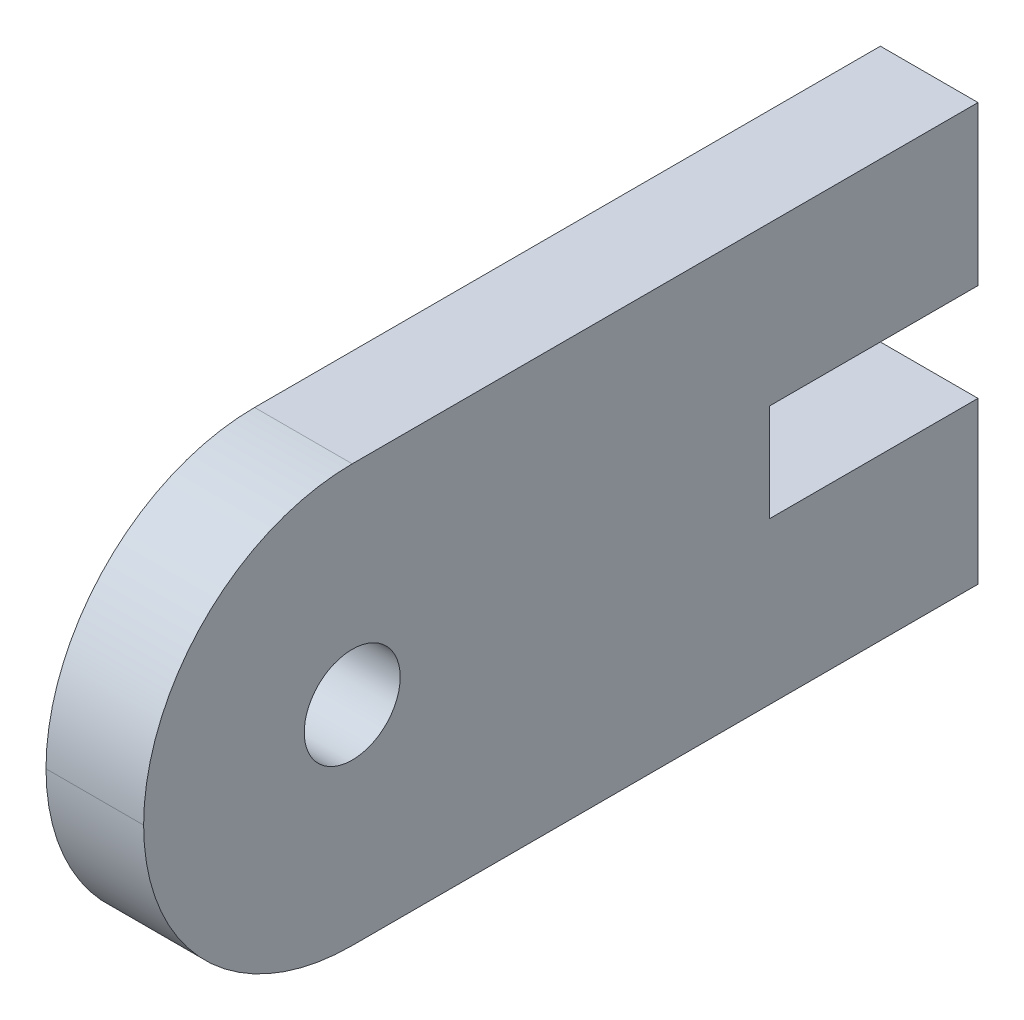
ISO-10303-21;
HEADER;
FILE_DESCRIPTION(('STEP AP214'),'2;1');
FILE_NAME('part.step','',(''),(''),'','','');
FILE_SCHEMA(('AUTOMOTIVE_DESIGN { 1 0 10303 214 1 1 1 1 }'));
ENDSEC;
DATA;
#1=APPLICATION_CONTEXT('core data for automotive mechanical design processes');
#2=APPLICATION_PROTOCOL_DEFINITION('international standard','automotive_design',2000,#1);
#3=PRODUCT_CONTEXT('',#1,'mechanical');
#4=PRODUCT('Part','Part','',(#3));
#5=PRODUCT_RELATED_PRODUCT_CATEGORY('part','',(#4));
#6=PRODUCT_DEFINITION_FORMATION('','',#4);
#7=PRODUCT_DEFINITION_CONTEXT('part definition',#1,'design');
#8=PRODUCT_DEFINITION('design','',#6,#7);
#9=PRODUCT_DEFINITION_SHAPE('','',#8);
#10=(LENGTH_UNIT() NAMED_UNIT(*) SI_UNIT(.MILLI.,.METRE.));
#11=(NAMED_UNIT(*) PLANE_ANGLE_UNIT() SI_UNIT($,.RADIAN.));
#12=(NAMED_UNIT(*) SI_UNIT($,.STERADIAN.) SOLID_ANGLE_UNIT());
#13=UNCERTAINTY_MEASURE_WITH_UNIT(LENGTH_MEASURE(1.E-05),#10,'distance_accuracy_value','');
#14=(GEOMETRIC_REPRESENTATION_CONTEXT(3) GLOBAL_UNCERTAINTY_ASSIGNED_CONTEXT((#13)) GLOBAL_UNIT_ASSIGNED_CONTEXT((#10,
#11,#12)) REPRESENTATION_CONTEXT('',''));
#15=CARTESIAN_POINT('',(0.,0.,0.));
#16=DIRECTION('',(0.,0.,1.));
#17=DIRECTION('',(1.,0.,0.));
#18=AXIS2_PLACEMENT_3D('',#15,#16,#17);
#19=CARTESIAN_POINT('',(2.9718,-6.35,-12.7));
#20=DIRECTION('',(0.,0.,1.));
#21=DIRECTION('',(1.,0.,0.));
#22=AXIS2_PLACEMENT_3D('',#19,#20,#21);
#23=PLANE('',#22);
#24=DIRECTION('',(0.,1.,0.));
#25=VECTOR('',#24,1.);
#26=CARTESIAN_POINT('',(2.9718,-6.35,-12.7));
#27=LINE('',#26,#25);
#28=CARTESIAN_POINT('',(2.9718,1.52297040845319,-12.7));
#29=VERTEX_POINT('',#28);
#30=CARTESIAN_POINT('',(2.9718,6.35,-12.7));
#31=VERTEX_POINT('',#30);
#32=EDGE_CURVE('E160',#29,#31,#27,.T.);
#33=ORIENTED_EDGE('',*,*,#32,.F.);
#34=DIRECTION('',(1.,0.,0.));
#35=VECTOR('',#34,1.);
#36=CARTESIAN_POINT('',(0.,1.52297040845319,-12.7));
#37=LINE('',#36,#35);
#38=CARTESIAN_POINT('',(0.,1.52297040845319,-12.7));
#39=VERTEX_POINT('',#38);
#40=EDGE_CURVE('E142',#39,#29,#37,.T.);
#41=ORIENTED_EDGE('',*,*,#40,.F.);
#42=DIRECTION('',(0.,1.,0.));
#43=VECTOR('',#42,1.);
#44=CARTESIAN_POINT('',(0.,-6.35,-12.7));
#45=LINE('',#44,#43);
#46=CARTESIAN_POINT('',(0.,6.35,-12.7));
#47=VERTEX_POINT('',#46);
#48=EDGE_CURVE('E133',#39,#47,#45,.T.);
#49=ORIENTED_EDGE('',*,*,#48,.T.);
#50=DIRECTION('',(-1.,0.,0.));
#51=VECTOR('',#50,1.);
#52=CARTESIAN_POINT('',(2.9718,6.35,-12.7));
#53=LINE('',#52,#51);
#54=EDGE_CURVE('E164',#31,#47,#53,.T.);
#55=ORIENTED_EDGE('',*,*,#54,.F.);
#56=EDGE_LOOP('',(#33,#41,#49,#55));
#57=FACE_BOUND('',#56,.T.);
#58=ADVANCED_FACE('F41',(#57),#23,.F.);
#59=CARTESIAN_POINT('',(2.9718,0.,0.));
#60=DIRECTION('',(1.,0.,0.));
#61=DIRECTION('',(0.,0.,-1.));
#62=AXIS2_PLACEMENT_3D('',#59,#60,#61);
#63=PLANE('',#62);
#64=DIRECTION('',(0.,0.,1.));
#65=VECTOR('',#64,1.);
#66=CARTESIAN_POINT('',(2.9718,6.35,12.7));
#67=LINE('',#66,#65);
#68=CARTESIAN_POINT('',(2.9718,6.35,6.35));
#69=VERTEX_POINT('',#68);
#70=EDGE_CURVE('E155',#31,#69,#67,.T.);
#71=ORIENTED_EDGE('',*,*,#70,.T.);
#72=CARTESIAN_POINT('',(2.9718,0.,6.35));
#73=DIRECTION('',(1.,0.,0.));
#74=DIRECTION('',(0.,0.,-1.));
#75=AXIS2_PLACEMENT_3D('',#72,#73,#74);
#76=CIRCLE('',#75,6.35);
#77=CARTESIAN_POINT('',(2.9718,0.,12.7));
#78=VERTEX_POINT('',#77);
#79=EDGE_CURVE('E50',#69,#78,#76,.T.);
#80=ORIENTED_EDGE('',*,*,#79,.T.);
#81=CARTESIAN_POINT('',(2.9718,0.,6.35));
#82=DIRECTION('',(1.,0.,0.));
#83=DIRECTION('',(0.,0.,-1.));
#84=AXIS2_PLACEMENT_3D('',#81,#82,#83);
#85=CIRCLE('',#84,6.35);
#86=CARTESIAN_POINT('',(2.9718,-6.35,6.35));
#87=VERTEX_POINT('',#86);
#88=EDGE_CURVE('E57',#78,#87,#85,.T.);
#89=ORIENTED_EDGE('',*,*,#88,.T.);
#90=DIRECTION('',(0.,0.,-1.));
#91=VECTOR('',#90,1.);
#92=CARTESIAN_POINT('',(2.9718,-6.35,12.7));
#93=LINE('',#92,#91);
#94=CARTESIAN_POINT('',(2.9718,-6.35,-12.7));
#95=VERTEX_POINT('',#94);
#96=EDGE_CURVE('E157',#87,#95,#93,.T.);
#97=ORIENTED_EDGE('',*,*,#96,.T.);
#98=CARTESIAN_POINT('',(2.9718,-1.44882959154681,-12.7));
#99=VERTEX_POINT('',#98);
#100=EDGE_CURVE('E161',#95,#99,#27,.T.);
#101=ORIENTED_EDGE('',*,*,#100,.T.);
#102=DIRECTION('',(0.,0.,-1.));
#103=VECTOR('',#102,1.);
#104=CARTESIAN_POINT('',(2.9718,-1.44882959154681,-12.7));
#105=LINE('',#104,#103);
#106=CARTESIAN_POINT('',(2.9718,-1.44882959154681,-6.35));
#107=VERTEX_POINT('',#106);
#108=EDGE_CURVE('E134',#107,#99,#105,.T.);
#109=ORIENTED_EDGE('',*,*,#108,.F.);
#110=DIRECTION('',(0.,-1.,0.));
#111=VECTOR('',#110,1.);
#112=CARTESIAN_POINT('',(2.9718,-1.44882959154681,-6.35));
#113=LINE('',#112,#111);
#114=CARTESIAN_POINT('',(2.9718,1.52297040845319,-6.35));
#115=VERTEX_POINT('',#114);
#116=EDGE_CURVE('E136',#115,#107,#113,.T.);
#117=ORIENTED_EDGE('',*,*,#116,.F.);
#118=DIRECTION('',(0.,0.,1.));
#119=VECTOR('',#118,1.);
#120=CARTESIAN_POINT('',(2.9718,1.52297040845319,-6.35));
#121=LINE('',#120,#119);
#122=EDGE_CURVE('E115',#29,#115,#121,.T.);
#123=ORIENTED_EDGE('',*,*,#122,.F.);
#124=ORIENTED_EDGE('',*,*,#32,.T.);
#125=EDGE_LOOP('',(#71,#80,#89,#97,#101,#109,#117,#123,#124));
#126=FACE_BOUND('',#125,.T.);
#127=CARTESIAN_POINT('',(2.9718,0.,6.35));
#128=DIRECTION('',(1.,0.,0.));
#129=DIRECTION('',(0.,0.,-1.));
#130=AXIS2_PLACEMENT_3D('',#127,#128,#129);
#131=CIRCLE('',#130,1.4605);
#132=CARTESIAN_POINT('',(2.9718,0.,4.8895));
#133=VERTEX_POINT('',#132);
#134=EDGE_CURVE('E149',#133,#133,#131,.T.);
#135=ORIENTED_EDGE('',*,*,#134,.F.);
#136=EDGE_LOOP('',(#135));
#137=FACE_BOUND('',#136,.T.);
#138=ADVANCED_FACE('F190',(#126,#137),#63,.T.);
#139=CARTESIAN_POINT('',(0.,0.,0.));
#140=DIRECTION('',(1.,0.,0.));
#141=DIRECTION('',(0.,0.,-1.));
#142=AXIS2_PLACEMENT_3D('',#139,#140,#141);
#143=PLANE('',#142);
#144=CARTESIAN_POINT('',(0.,0.,6.35));
#145=DIRECTION('',(1.,0.,0.));
#146=DIRECTION('',(0.,0.,-1.));
#147=AXIS2_PLACEMENT_3D('',#144,#145,#146);
#148=CIRCLE('',#147,6.35);
#149=CARTESIAN_POINT('',(0.,-6.35,6.35));
#150=VERTEX_POINT('',#149);
#151=CARTESIAN_POINT('',(0.,0.,12.7));
#152=VERTEX_POINT('',#151);
#153=EDGE_CURVE('E176',#150,#152,#148,.F.);
#154=ORIENTED_EDGE('',*,*,#153,.T.);
#155=CARTESIAN_POINT('',(0.,0.,6.35));
#156=DIRECTION('',(1.,0.,0.));
#157=DIRECTION('',(0.,0.,-1.));
#158=AXIS2_PLACEMENT_3D('',#155,#156,#157);
#159=CIRCLE('',#158,6.35);
#160=CARTESIAN_POINT('',(0.,6.35,6.35));
#161=VERTEX_POINT('',#160);
#162=EDGE_CURVE('E178',#152,#161,#159,.F.);
#163=ORIENTED_EDGE('',*,*,#162,.T.);
#164=DIRECTION('',(0.,0.,1.));
#165=VECTOR('',#164,1.);
#166=CARTESIAN_POINT('',(0.,6.35,12.7));
#167=LINE('',#166,#165);
#168=EDGE_CURVE('E152',#47,#161,#167,.T.);
#169=ORIENTED_EDGE('',*,*,#168,.F.);
#170=ORIENTED_EDGE('',*,*,#48,.F.);
#171=DIRECTION('',(0.,0.,1.));
#172=VECTOR('',#171,1.);
#173=CARTESIAN_POINT('',(0.,1.52297040845319,-6.35));
#174=LINE('',#173,#172);
#175=CARTESIAN_POINT('',(0.,1.52297040845319,-6.35));
#176=VERTEX_POINT('',#175);
#177=EDGE_CURVE('E112',#39,#176,#174,.T.);
#178=ORIENTED_EDGE('',*,*,#177,.T.);
#179=DIRECTION('',(0.,-1.,0.));
#180=VECTOR('',#179,1.);
#181=CARTESIAN_POINT('',(0.,-1.44882959154681,-6.35));
#182=LINE('',#181,#180);
#183=CARTESIAN_POINT('',(0.,-1.44882959154681,-6.35));
#184=VERTEX_POINT('',#183);
#185=EDGE_CURVE('E123',#176,#184,#182,.T.);
#186=ORIENTED_EDGE('',*,*,#185,.T.);
#187=DIRECTION('',(0.,0.,-1.));
#188=VECTOR('',#187,1.);
#189=CARTESIAN_POINT('',(0.,-1.44882959154681,-12.7));
#190=LINE('',#189,#188);
#191=CARTESIAN_POINT('',(0.,-1.44882959154681,-12.7));
#192=VERTEX_POINT('',#191);
#193=EDGE_CURVE('E120',#184,#192,#190,.T.);
#194=ORIENTED_EDGE('',*,*,#193,.T.);
#195=CARTESIAN_POINT('',(0.,-6.35,-12.7));
#196=VERTEX_POINT('',#195);
#197=EDGE_CURVE('E158',#196,#192,#45,.T.);
#198=ORIENTED_EDGE('',*,*,#197,.F.);
#199=DIRECTION('',(0.,0.,-1.));
#200=VECTOR('',#199,1.);
#201=CARTESIAN_POINT('',(0.,-6.35,12.7));
#202=LINE('',#201,#200);
#203=EDGE_CURVE('E167',#150,#196,#202,.T.);
#204=ORIENTED_EDGE('',*,*,#203,.F.);
#205=EDGE_LOOP('',(#154,#163,#169,#170,#178,#186,#194,#198,#204));
#206=FACE_BOUND('',#205,.T.);
#207=CARTESIAN_POINT('',(0.,0.,6.35));
#208=DIRECTION('',(1.,0.,0.));
#209=DIRECTION('',(0.,0.,-1.));
#210=AXIS2_PLACEMENT_3D('',#207,#208,#209);
#211=CIRCLE('',#210,1.4605);
#212=CARTESIAN_POINT('',(0.,0.,4.8895));
#213=VERTEX_POINT('',#212);
#214=EDGE_CURVE('E144',#213,#213,#211,.T.);
#215=ORIENTED_EDGE('',*,*,#214,.T.);
#216=EDGE_LOOP('',(#215));
#217=FACE_BOUND('',#216,.T.);
#218=ADVANCED_FACE('F130',(#206,#217),#143,.F.);
#219=CARTESIAN_POINT('',(2.9718,6.35,12.7));
#220=DIRECTION('',(0.,-1.,0.));
#221=DIRECTION('',(0.,0.,-1.));
#222=AXIS2_PLACEMENT_3D('',#219,#220,#221);
#223=PLANE('',#222);
#224=ORIENTED_EDGE('',*,*,#168,.T.);
#225=DIRECTION('',(-1.,0.,0.));
#226=VECTOR('',#225,1.);
#227=CARTESIAN_POINT('',(2.9718,6.35,6.35));
#228=LINE('',#227,#226);
#229=EDGE_CURVE('E180',#161,#69,#228,.F.);
#230=ORIENTED_EDGE('',*,*,#229,.T.);
#231=ORIENTED_EDGE('',*,*,#70,.F.);
#232=ORIENTED_EDGE('',*,*,#54,.T.);
#233=EDGE_LOOP('',(#224,#230,#231,#232));
#234=FACE_BOUND('',#233,.T.);
#235=ADVANCED_FACE('F187',(#234),#223,.F.);
#236=CARTESIAN_POINT('',(2.9718,-6.35,12.7));
#237=DIRECTION('',(0.,1.,0.));
#238=DIRECTION('',(0.,0.,1.));
#239=AXIS2_PLACEMENT_3D('',#236,#237,#238);
#240=PLANE('',#239);
#241=ORIENTED_EDGE('',*,*,#96,.F.);
#242=DIRECTION('',(-1.,0.,0.));
#243=VECTOR('',#242,1.);
#244=CARTESIAN_POINT('',(2.9718,-6.35,6.35));
#245=LINE('',#244,#243);
#246=EDGE_CURVE('E11',#87,#150,#245,.T.);
#247=ORIENTED_EDGE('',*,*,#246,.T.);
#248=ORIENTED_EDGE('',*,*,#203,.T.);
#249=DIRECTION('',(-1.,0.,0.));
#250=VECTOR('',#249,1.);
#251=CARTESIAN_POINT('',(2.9718,-6.35,-12.7));
#252=LINE('',#251,#250);
#253=EDGE_CURVE('E173',#95,#196,#252,.T.);
#254=ORIENTED_EDGE('',*,*,#253,.F.);
#255=EDGE_LOOP('',(#241,#247,#248,#254));
#256=FACE_BOUND('',#255,.T.);
#257=ADVANCED_FACE('F203',(#256),#240,.F.);
#258=ORIENTED_EDGE('',*,*,#197,.T.);
#259=DIRECTION('',(1.,0.,0.));
#260=VECTOR('',#259,1.);
#261=CARTESIAN_POINT('',(0.,-1.44882959154681,-12.7));
#262=LINE('',#261,#260);
#263=EDGE_CURVE('E145',#192,#99,#262,.T.);
#264=ORIENTED_EDGE('',*,*,#263,.T.);
#265=ORIENTED_EDGE('',*,*,#100,.F.);
#266=ORIENTED_EDGE('',*,*,#253,.T.);
#267=EDGE_LOOP('',(#258,#264,#265,#266));
#268=FACE_BOUND('',#267,.T.);
#269=ADVANCED_FACE('F207',(#268),#23,.F.);
#270=CARTESIAN_POINT('',(2.9718,0.,6.35));
#271=DIRECTION('',(-1.,0.,0.));
#272=DIRECTION('',(0.,0.,1.));
#273=AXIS2_PLACEMENT_3D('',#270,#271,#272);
#274=CYLINDRICAL_SURFACE('',#273,1.4605);
#275=ORIENTED_EDGE('',*,*,#134,.T.);
#276=EDGE_LOOP('',(#275));
#277=FACE_BOUND('',#276,.T.);
#278=ORIENTED_EDGE('',*,*,#214,.F.);
#279=EDGE_LOOP('',(#278));
#280=FACE_BOUND('',#279,.T.);
#281=ADVANCED_FACE('F219',(#277,#280),#274,.F.);
#282=CARTESIAN_POINT('',(0.,1.52297040845319,-6.35));
#283=DIRECTION('',(0.,1.,0.));
#284=DIRECTION('',(0.,0.,1.));
#285=AXIS2_PLACEMENT_3D('',#282,#283,#284);
#286=PLANE('',#285);
#287=ORIENTED_EDGE('',*,*,#122,.T.);
#288=DIRECTION('',(1.,0.,0.));
#289=VECTOR('',#288,1.);
#290=CARTESIAN_POINT('',(0.,1.52297040845319,-6.35));
#291=LINE('',#290,#289);
#292=EDGE_CURVE('E108',#176,#115,#291,.T.);
#293=ORIENTED_EDGE('',*,*,#292,.F.);
#294=ORIENTED_EDGE('',*,*,#177,.F.);
#295=ORIENTED_EDGE('',*,*,#40,.T.);
#296=EDGE_LOOP('',(#287,#293,#294,#295));
#297=FACE_BOUND('',#296,.T.);
#298=ADVANCED_FACE('F110',(#297),#286,.F.);
#299=CARTESIAN_POINT('',(0.,-1.44882959154681,-12.7));
#300=DIRECTION('',(0.,-1.,0.));
#301=DIRECTION('',(0.,0.,-1.));
#302=AXIS2_PLACEMENT_3D('',#299,#300,#301);
#303=PLANE('',#302);
#304=ORIENTED_EDGE('',*,*,#108,.T.);
#305=ORIENTED_EDGE('',*,*,#263,.F.);
#306=ORIENTED_EDGE('',*,*,#193,.F.);
#307=DIRECTION('',(1.,0.,0.));
#308=VECTOR('',#307,1.);
#309=CARTESIAN_POINT('',(0.,-1.44882959154681,-6.35));
#310=LINE('',#309,#308);
#311=EDGE_CURVE('E119',#184,#107,#310,.T.);
#312=ORIENTED_EDGE('',*,*,#311,.T.);
#313=EDGE_LOOP('',(#304,#305,#306,#312));
#314=FACE_BOUND('',#313,.T.);
#315=ADVANCED_FACE('F211',(#314),#303,.F.);
#316=CARTESIAN_POINT('',(0.,-1.44882959154681,-6.35));
#317=DIRECTION('',(0.,0.,1.));
#318=DIRECTION('',(1.,0.,0.));
#319=AXIS2_PLACEMENT_3D('',#316,#317,#318);
#320=PLANE('',#319);
#321=ORIENTED_EDGE('',*,*,#116,.T.);
#322=ORIENTED_EDGE('',*,*,#311,.F.);
#323=ORIENTED_EDGE('',*,*,#185,.F.);
#324=ORIENTED_EDGE('',*,*,#292,.T.);
#325=EDGE_LOOP('',(#321,#322,#323,#324));
#326=FACE_BOUND('',#325,.T.);
#327=ADVANCED_FACE('F124',(#326),#320,.F.);
#328=CARTESIAN_POINT('',(2.9718,0.,6.35));
#329=DIRECTION('',(-1.,0.,0.));
#330=DIRECTION('',(0.,0.,1.));
#331=AXIS2_PLACEMENT_3D('',#328,#329,#330);
#332=CYLINDRICAL_SURFACE('',#331,6.35);
#333=ORIENTED_EDGE('',*,*,#246,.F.);
#334=ORIENTED_EDGE('',*,*,#88,.F.);
#335=DIRECTION('',(-1.,0.,0.));
#336=VECTOR('',#335,1.);
#337=CARTESIAN_POINT('',(2.9718,0.,12.7));
#338=LINE('',#337,#336);
#339=EDGE_CURVE('E45',#152,#78,#338,.F.);
#340=ORIENTED_EDGE('',*,*,#339,.F.);
#341=ORIENTED_EDGE('',*,*,#153,.F.);
#342=EDGE_LOOP('',(#333,#334,#340,#341));
#343=FACE_BOUND('',#342,.T.);
#344=ADVANCED_FACE('F43',(#343),#332,.T.);
#345=CARTESIAN_POINT('',(2.9718,0.,6.35));
#346=DIRECTION('',(-1.,0.,0.));
#347=DIRECTION('',(0.,0.,1.));
#348=AXIS2_PLACEMENT_3D('',#345,#346,#347);
#349=CYLINDRICAL_SURFACE('',#348,6.35);
#350=ORIENTED_EDGE('',*,*,#79,.F.);
#351=ORIENTED_EDGE('',*,*,#229,.F.);
#352=ORIENTED_EDGE('',*,*,#162,.F.);
#353=ORIENTED_EDGE('',*,*,#339,.T.);
#354=EDGE_LOOP('',(#350,#351,#352,#353));
#355=FACE_BOUND('',#354,.T.);
#356=ADVANCED_FACE('F199',(#355),#349,.T.);
#357=CLOSED_SHELL('',(#58,#138,#218,#235,#257,#269,#281,#298,#315,#327,#344,#356));
#358=MANIFOLD_SOLID_BREP('B2',#357);
#359=ADVANCED_BREP_SHAPE_REPRESENTATION('',(#18,#358),#14);
#360=SHAPE_DEFINITION_REPRESENTATION(#9,#359);
ENDSEC;
END-ISO-10303-21;
